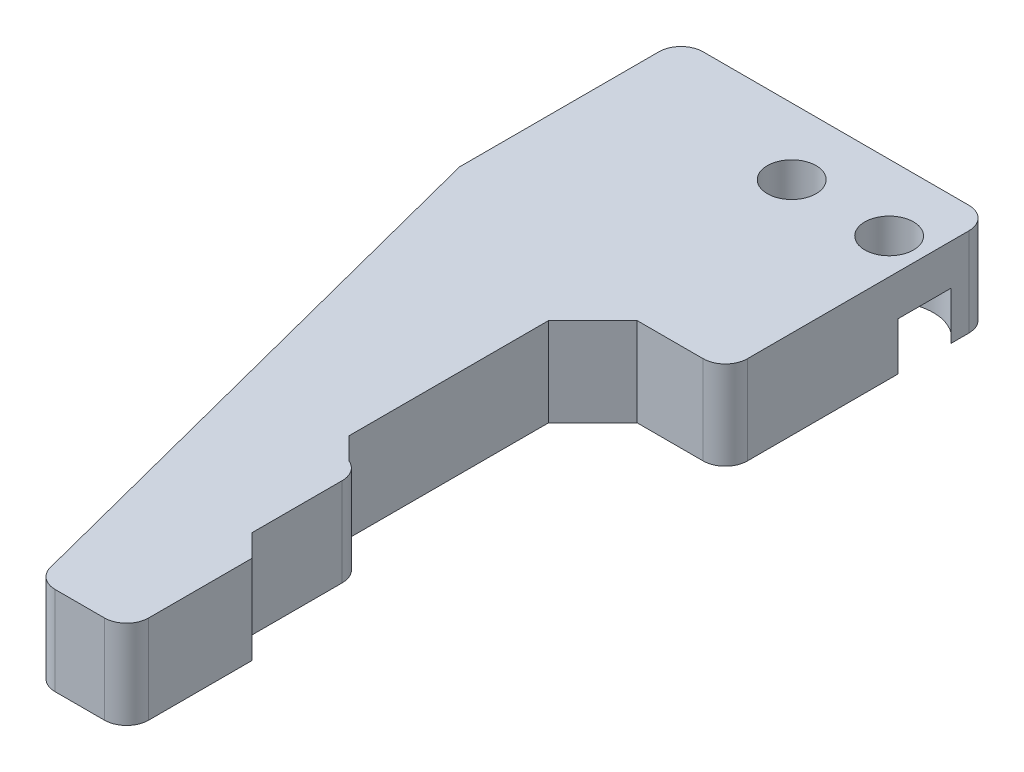
ISO-10303-21;
HEADER;
FILE_DESCRIPTION(('STEP AP214'),'2;1');
FILE_NAME('part.step','',(''),(''),'','','');
FILE_SCHEMA(('AUTOMOTIVE_DESIGN { 1 0 10303 214 1 1 1 1 }'));
ENDSEC;
DATA;
#1=APPLICATION_CONTEXT('core data for automotive mechanical design processes');
#2=APPLICATION_PROTOCOL_DEFINITION('international standard','automotive_design',2000,#1);
#3=PRODUCT_CONTEXT('',#1,'mechanical');
#4=PRODUCT('Part','Part','',(#3));
#5=PRODUCT_RELATED_PRODUCT_CATEGORY('part','',(#4));
#6=PRODUCT_DEFINITION_FORMATION('','',#4);
#7=PRODUCT_DEFINITION_CONTEXT('part definition',#1,'design');
#8=PRODUCT_DEFINITION('design','',#6,#7);
#9=PRODUCT_DEFINITION_SHAPE('','',#8);
#10=(LENGTH_UNIT() NAMED_UNIT(*) SI_UNIT(.MILLI.,.METRE.));
#11=(NAMED_UNIT(*) PLANE_ANGLE_UNIT() SI_UNIT($,.RADIAN.));
#12=(NAMED_UNIT(*) SI_UNIT($,.STERADIAN.) SOLID_ANGLE_UNIT());
#13=UNCERTAINTY_MEASURE_WITH_UNIT(LENGTH_MEASURE(1.E-05),#10,'distance_accuracy_value','');
#14=(GEOMETRIC_REPRESENTATION_CONTEXT(3) GLOBAL_UNCERTAINTY_ASSIGNED_CONTEXT((#13)) GLOBAL_UNIT_ASSIGNED_CONTEXT((#10,
#11,#12)) REPRESENTATION_CONTEXT('',''));
#15=CARTESIAN_POINT('',(0.,0.,0.));
#16=DIRECTION('',(0.,0.,1.));
#17=DIRECTION('',(1.,0.,0.));
#18=AXIS2_PLACEMENT_3D('',#15,#16,#17);
#19=CARTESIAN_POINT('',(0.,10.,-59.1354626519124));
#20=DIRECTION('',(-1.,0.,0.));
#21=DIRECTION('',(0.,0.,1.));
#22=AXIS2_PLACEMENT_3D('',#19,#20,#21);
#23=PLANE('',#22);
#24=DIRECTION('',(0.,0.,-1.));
#25=VECTOR('',#24,1.);
#26=CARTESIAN_POINT('',(0.,5.4,-59.1354626519124));
#27=LINE('',#26,#25);
#28=CARTESIAN_POINT('',(0.,5.4,-78.6354626519124));
#29=VERTEX_POINT('',#28);
#30=CARTESIAN_POINT('',(0.,5.4,-84.6354626519124));
#31=VERTEX_POINT('',#30);
#32=EDGE_CURVE('E11',#29,#31,#27,.T.);
#33=ORIENTED_EDGE('',*,*,#32,.T.);
#34=DIRECTION('',(0.,-1.,0.));
#35=VECTOR('',#34,1.);
#36=CARTESIAN_POINT('',(0.,0.,-84.6354626519124));
#37=LINE('',#36,#35);
#38=CARTESIAN_POINT('',(0.,0.,-84.6354626519124));
#39=VERTEX_POINT('',#38);
#40=EDGE_CURVE('E173',#31,#39,#37,.T.);
#41=ORIENTED_EDGE('',*,*,#40,.T.);
#42=DIRECTION('',(0.,0.,-1.));
#43=VECTOR('',#42,1.);
#44=CARTESIAN_POINT('',(0.,0.,-59.1354626519124));
#45=LINE('',#44,#43);
#46=CARTESIAN_POINT('',(0.,0.,-86.6354626519124));
#47=VERTEX_POINT('',#46);
#48=EDGE_CURVE('E206',#39,#47,#45,.T.);
#49=ORIENTED_EDGE('',*,*,#48,.T.);
#50=DIRECTION('',(0.,-1.,0.));
#51=VECTOR('',#50,1.);
#52=CARTESIAN_POINT('',(0.,10.,-86.6354626519124));
#53=LINE('',#52,#51);
#54=CARTESIAN_POINT('',(0.,10.,-86.6354626519124));
#55=VERTEX_POINT('',#54);
#56=EDGE_CURVE('E307',#47,#55,#53,.F.);
#57=ORIENTED_EDGE('',*,*,#56,.T.);
#58=DIRECTION('',(0.,0.,-1.));
#59=VECTOR('',#58,1.);
#60=CARTESIAN_POINT('',(0.,10.,-59.1354626519124));
#61=LINE('',#60,#59);
#62=CARTESIAN_POINT('',(0.,10.,-61.6354626519124));
#63=VERTEX_POINT('',#62);
#64=EDGE_CURVE('E207',#63,#55,#61,.T.);
#65=ORIENTED_EDGE('',*,*,#64,.F.);
#66=DIRECTION('',(0.,-1.,0.));
#67=VECTOR('',#66,1.);
#68=CARTESIAN_POINT('',(0.,10.,-61.6354626519124));
#69=LINE('',#68,#67);
#70=CARTESIAN_POINT('',(0.,0.,-61.6354626519124));
#71=VERTEX_POINT('',#70);
#72=EDGE_CURVE('E305',#63,#71,#69,.T.);
#73=ORIENTED_EDGE('',*,*,#72,.T.);
#74=CARTESIAN_POINT('',(0.,0.,-78.6354626519124));
#75=VERTEX_POINT('',#74);
#76=EDGE_CURVE('E188',#71,#75,#45,.T.);
#77=ORIENTED_EDGE('',*,*,#76,.T.);
#78=DIRECTION('',(0.,-1.,0.));
#79=VECTOR('',#78,1.);
#80=CARTESIAN_POINT('',(0.,0.,-78.6354626519124));
#81=LINE('',#80,#79);
#82=EDGE_CURVE('E50',#75,#29,#81,.F.);
#83=ORIENTED_EDGE('',*,*,#82,.T.);
#84=EDGE_LOOP('',(#33,#41,#49,#57,#65,#73,#77,#83));
#85=FACE_BOUND('',#84,.T.);
#86=ADVANCED_FACE('F35',(#85),#23,.F.);
#87=CARTESIAN_POINT('',(0.,10.,-89.1354626519124));
#88=DIRECTION('',(0.,0.,1.));
#89=DIRECTION('',(1.,0.,0.));
#90=AXIS2_PLACEMENT_3D('',#87,#88,#89);
#91=PLANE('',#90);
#92=DIRECTION('',(-1.,0.,0.));
#93=VECTOR('',#92,1.);
#94=CARTESIAN_POINT('',(0.,10.,-89.1354626519124));
#95=LINE('',#94,#93);
#96=CARTESIAN_POINT('',(-2.5,10.,-89.1354626519124));
#97=VERTEX_POINT('',#96);
#98=CARTESIAN_POINT('',(-32.5,10.,-89.1354626519124));
#99=VERTEX_POINT('',#98);
#100=EDGE_CURVE('E210',#97,#99,#95,.T.);
#101=ORIENTED_EDGE('',*,*,#100,.F.);
#102=DIRECTION('',(0.,-1.,0.));
#103=VECTOR('',#102,1.);
#104=CARTESIAN_POINT('',(-2.5,10.,-89.1354626519124));
#105=LINE('',#104,#103);
#106=CARTESIAN_POINT('',(-2.5,0.,-89.1354626519124));
#107=VERTEX_POINT('',#106);
#108=EDGE_CURVE('E289',#97,#107,#105,.T.);
#109=ORIENTED_EDGE('',*,*,#108,.T.);
#110=DIRECTION('',(-1.,0.,0.));
#111=VECTOR('',#110,1.);
#112=CARTESIAN_POINT('',(0.,0.,-89.1354626519124));
#113=LINE('',#112,#111);
#114=CARTESIAN_POINT('',(-32.5,0.,-89.1354626519124));
#115=VERTEX_POINT('',#114);
#116=EDGE_CURVE('E233',#107,#115,#113,.T.);
#117=ORIENTED_EDGE('',*,*,#116,.T.);
#118=DIRECTION('',(0.,-1.,0.));
#119=VECTOR('',#118,1.);
#120=CARTESIAN_POINT('',(-32.5,10.,-89.1354626519124));
#121=LINE('',#120,#119);
#122=EDGE_CURVE('E287',#115,#99,#121,.F.);
#123=ORIENTED_EDGE('',*,*,#122,.T.);
#124=EDGE_LOOP('',(#101,#109,#117,#123));
#125=FACE_BOUND('',#124,.T.);
#126=ADVANCED_FACE('F351',(#125),#91,.F.);
#127=CARTESIAN_POINT('',(-35.,10.,-64.1354626519124));
#128=DIRECTION('',(1.,0.,0.));
#129=DIRECTION('',(0.,0.,-1.));
#130=AXIS2_PLACEMENT_3D('',#127,#128,#129);
#131=PLANE('',#130);
#132=DIRECTION('',(0.,0.,1.));
#133=VECTOR('',#132,1.);
#134=CARTESIAN_POINT('',(-35.,10.,-64.1354626519124));
#135=LINE('',#134,#133);
#136=CARTESIAN_POINT('',(-35.,10.,-86.6354626519124));
#137=VERTEX_POINT('',#136);
#138=CARTESIAN_POINT('',(-35.,10.,-64.1354626519124));
#139=VERTEX_POINT('',#138);
#140=EDGE_CURVE('E214',#137,#139,#135,.T.);
#141=ORIENTED_EDGE('',*,*,#140,.F.);
#142=DIRECTION('',(0.,-1.,0.));
#143=VECTOR('',#142,1.);
#144=CARTESIAN_POINT('',(-35.,10.,-86.6354626519124));
#145=LINE('',#144,#143);
#146=CARTESIAN_POINT('',(-35.,0.,-86.6354626519124));
#147=VERTEX_POINT('',#146);
#148=EDGE_CURVE('E331',#137,#147,#145,.T.);
#149=ORIENTED_EDGE('',*,*,#148,.T.);
#150=DIRECTION('',(0.,0.,1.));
#151=VECTOR('',#150,1.);
#152=CARTESIAN_POINT('',(-35.,0.,-64.1354626519124));
#153=LINE('',#152,#151);
#154=CARTESIAN_POINT('',(-35.,0.,-64.1354626519124));
#155=VERTEX_POINT('',#154);
#156=EDGE_CURVE('E236',#147,#155,#153,.T.);
#157=ORIENTED_EDGE('',*,*,#156,.T.);
#158=DIRECTION('',(0.,-1.,0.));
#159=VECTOR('',#158,1.);
#160=CARTESIAN_POINT('',(-35.,10.,-64.1354626519124));
#161=LINE('',#160,#159);
#162=EDGE_CURVE('E254',#139,#155,#161,.T.);
#163=ORIENTED_EDGE('',*,*,#162,.F.);
#164=EDGE_LOOP('',(#141,#149,#157,#163));
#165=FACE_BOUND('',#164,.T.);
#166=ADVANCED_FACE('F361',(#165),#131,.F.);
#167=CARTESIAN_POINT('',(-18.45,10.,0.));
#168=DIRECTION('',(0.968281294725216,0.,-0.249862630829942));
#169=DIRECTION('',(-0.249862630829942,0.,-0.968281294725216));
#170=AXIS2_PLACEMENT_3D('',#167,#168,#169);
#171=PLANE('',#170);
#172=DIRECTION('',(0.249862630829942,0.,0.968281294725216));
#173=VECTOR('',#172,1.);
#174=CARTESIAN_POINT('',(-18.45,0.,0.));
#175=LINE('',#174,#173);
#176=CARTESIAN_POINT('',(-18.9339278047756,0.,-1.87534342292514));
#177=VERTEX_POINT('',#176);
#178=EDGE_CURVE('E238',#155,#177,#175,.T.);
#179=ORIENTED_EDGE('',*,*,#178,.T.);
#180=DIRECTION('',(0.,-1.,0.));
#181=VECTOR('',#180,1.);
#182=CARTESIAN_POINT('',(-18.9339278047756,10.,-1.87534342292514));
#183=LINE('',#182,#181);
#184=CARTESIAN_POINT('',(-18.9339278047756,10.,-1.87534342292514));
#185=VERTEX_POINT('',#184);
#186=EDGE_CURVE('E329',#177,#185,#183,.F.);
#187=ORIENTED_EDGE('',*,*,#186,.T.);
#188=DIRECTION('',(0.249862630829942,0.,0.968281294725216));
#189=VECTOR('',#188,1.);
#190=CARTESIAN_POINT('',(-18.45,10.,0.));
#191=LINE('',#190,#189);
#192=EDGE_CURVE('E216',#139,#185,#191,.T.);
#193=ORIENTED_EDGE('',*,*,#192,.F.);
#194=ORIENTED_EDGE('',*,*,#162,.T.);
#195=EDGE_LOOP('',(#179,#187,#193,#194));
#196=FACE_BOUND('',#195,.T.);
#197=ADVANCED_FACE('F564',(#196),#171,.F.);
#198=CARTESIAN_POINT('',(-8.44999999999999,10.,0.));
#199=DIRECTION('',(0.,0.,-1.));
#200=DIRECTION('',(-1.,0.,0.));
#201=AXIS2_PLACEMENT_3D('',#198,#199,#200);
#202=PLANE('',#201);
#203=DIRECTION('',(1.,0.,0.));
#204=VECTOR('',#203,1.);
#205=CARTESIAN_POINT('',(-8.44999999999999,0.,0.));
#206=LINE('',#205,#204);
#207=CARTESIAN_POINT('',(-16.5132245679626,0.,0.));
#208=VERTEX_POINT('',#207);
#209=CARTESIAN_POINT('',(-10.95,0.,0.));
#210=VERTEX_POINT('',#209);
#211=EDGE_CURVE('E241',#208,#210,#206,.T.);
#212=ORIENTED_EDGE('',*,*,#211,.T.);
#213=DIRECTION('',(0.,-1.,0.));
#214=VECTOR('',#213,1.);
#215=CARTESIAN_POINT('',(-10.95,10.,0.));
#216=LINE('',#215,#214);
#217=CARTESIAN_POINT('',(-10.95,10.,0.));
#218=VERTEX_POINT('',#217);
#219=EDGE_CURVE('E327',#210,#218,#216,.F.);
#220=ORIENTED_EDGE('',*,*,#219,.T.);
#221=DIRECTION('',(1.,0.,0.));
#222=VECTOR('',#221,1.);
#223=CARTESIAN_POINT('',(-8.44999999999999,10.,0.));
#224=LINE('',#223,#222);
#225=CARTESIAN_POINT('',(-16.5132245679626,10.,0.));
#226=VERTEX_POINT('',#225);
#227=EDGE_CURVE('E219',#226,#218,#224,.T.);
#228=ORIENTED_EDGE('',*,*,#227,.F.);
#229=DIRECTION('',(0.,-1.,0.));
#230=VECTOR('',#229,1.);
#231=CARTESIAN_POINT('',(-16.5132245679626,10.,0.));
#232=LINE('',#231,#230);
#233=EDGE_CURVE('E324',#226,#208,#232,.T.);
#234=ORIENTED_EDGE('',*,*,#233,.T.);
#235=EDGE_LOOP('',(#212,#220,#228,#234));
#236=FACE_BOUND('',#235,.T.);
#237=ADVANCED_FACE('F373',(#236),#202,.F.);
#238=CARTESIAN_POINT('',(-8.44999999999999,10.,-14.1354626519124));
#239=DIRECTION('',(-1.,0.,0.));
#240=DIRECTION('',(0.,0.,1.));
#241=AXIS2_PLACEMENT_3D('',#238,#239,#240);
#242=PLANE('',#241);
#243=DIRECTION('',(0.,0.,-1.));
#244=VECTOR('',#243,1.);
#245=CARTESIAN_POINT('',(-8.44999999999999,10.,-14.1354626519124));
#246=LINE('',#245,#244);
#247=CARTESIAN_POINT('',(-8.44999999999999,10.,-2.5));
#248=VERTEX_POINT('',#247);
#249=CARTESIAN_POINT('',(-8.44999999999999,10.,-14.1354626519124));
#250=VERTEX_POINT('',#249);
#251=EDGE_CURVE('E222',#248,#250,#246,.T.);
#252=ORIENTED_EDGE('',*,*,#251,.F.);
#253=DIRECTION('',(0.,-1.,0.));
#254=VECTOR('',#253,1.);
#255=CARTESIAN_POINT('',(-8.44999999999999,10.,-2.5));
#256=LINE('',#255,#254);
#257=CARTESIAN_POINT('',(-8.44999999999999,0.,-2.5));
#258=VERTEX_POINT('',#257);
#259=EDGE_CURVE('E321',#248,#258,#256,.T.);
#260=ORIENTED_EDGE('',*,*,#259,.T.);
#261=DIRECTION('',(0.,0.,-1.));
#262=VECTOR('',#261,1.);
#263=CARTESIAN_POINT('',(-8.44999999999999,0.,-14.1354626519124));
#264=LINE('',#263,#262);
#265=CARTESIAN_POINT('',(-8.44999999999999,0.,-14.1354626519124));
#266=VERTEX_POINT('',#265);
#267=EDGE_CURVE('E244',#258,#266,#264,.T.);
#268=ORIENTED_EDGE('',*,*,#267,.T.);
#269=DIRECTION('',(0.,-1.,0.));
#270=VECTOR('',#269,1.);
#271=CARTESIAN_POINT('',(-8.44999999999999,10.,-14.1354626519124));
#272=LINE('',#271,#270);
#273=EDGE_CURVE('E231',#250,#266,#272,.T.);
#274=ORIENTED_EDGE('',*,*,#273,.F.);
#275=EDGE_LOOP('',(#252,#260,#268,#274));
#276=FACE_BOUND('',#275,.T.);
#277=ADVANCED_FACE('F382',(#276),#242,.F.);
#278=CARTESIAN_POINT('',(-10.95,10.,-29.1354626519124));
#279=DIRECTION('',(-1.,0.,0.));
#280=DIRECTION('',(0.,0.,1.));
#281=AXIS2_PLACEMENT_3D('',#278,#279,#280);
#282=PLANE('',#281);
#283=DIRECTION('',(0.,0.,-1.));
#284=VECTOR('',#283,1.);
#285=CARTESIAN_POINT('',(-10.95,0.,-29.1354626519124));
#286=LINE('',#285,#284);
#287=CARTESIAN_POINT('',(-10.95,0.,-16.6354626519124));
#288=VERTEX_POINT('',#287);
#289=CARTESIAN_POINT('',(-10.95,0.,-26.8441748044345));
#290=VERTEX_POINT('',#289);
#291=EDGE_CURVE('E246',#288,#290,#286,.T.);
#292=ORIENTED_EDGE('',*,*,#291,.T.);
#293=DIRECTION('',(0.,1.,0.));
#294=VECTOR('',#293,1.);
#295=CARTESIAN_POINT('',(-10.95,10.,-26.8441748044345));
#296=LINE('',#295,#294);
#297=CARTESIAN_POINT('',(-10.95,10.,-26.8441748044345));
#298=VERTEX_POINT('',#297);
#299=EDGE_CURVE('E335',#290,#298,#296,.T.);
#300=ORIENTED_EDGE('',*,*,#299,.T.);
#301=DIRECTION('',(0.,0.,-1.));
#302=VECTOR('',#301,1.);
#303=CARTESIAN_POINT('',(-10.95,10.,-29.1354626519124));
#304=LINE('',#303,#302);
#305=CARTESIAN_POINT('',(-10.95,10.,-16.6354626519124));
#306=VERTEX_POINT('',#305);
#307=EDGE_CURVE('E224',#306,#298,#304,.T.);
#308=ORIENTED_EDGE('',*,*,#307,.F.);
#309=DIRECTION('',(0.,-1.,0.));
#310=VECTOR('',#309,1.);
#311=CARTESIAN_POINT('',(-10.95,0.,-16.6354626519124));
#312=LINE('',#311,#310);
#313=EDGE_CURVE('E268',#306,#288,#312,.T.);
#314=ORIENTED_EDGE('',*,*,#313,.T.);
#315=EDGE_LOOP('',(#292,#300,#308,#314));
#316=FACE_BOUND('',#315,.T.);
#317=ADVANCED_FACE('F390',(#316),#282,.F.);
#318=CARTESIAN_POINT('',(-14.95,10.,-59.1354626519124));
#319=DIRECTION('',(-1.,0.,0.));
#320=DIRECTION('',(0.,0.,1.));
#321=AXIS2_PLACEMENT_3D('',#318,#319,#320);
#322=PLANE('',#321);
#323=DIRECTION('',(0.,0.,-1.));
#324=VECTOR('',#323,1.);
#325=CARTESIAN_POINT('',(-14.95,10.,-59.1354626519124));
#326=LINE('',#325,#324);
#327=CARTESIAN_POINT('',(-14.95,10.,-31.6354626519124));
#328=VERTEX_POINT('',#327);
#329=CARTESIAN_POINT('',(-14.95,10.,-54.1354626519124));
#330=VERTEX_POINT('',#329);
#331=EDGE_CURVE('E227',#328,#330,#326,.T.);
#332=ORIENTED_EDGE('',*,*,#331,.F.);
#333=DIRECTION('',(0.,-1.,0.));
#334=VECTOR('',#333,1.);
#335=CARTESIAN_POINT('',(-14.95,0.,-31.6354626519124));
#336=LINE('',#335,#334);
#337=CARTESIAN_POINT('',(-14.95,0.,-31.6354626519124));
#338=VERTEX_POINT('',#337);
#339=EDGE_CURVE('E271',#328,#338,#336,.T.);
#340=ORIENTED_EDGE('',*,*,#339,.T.);
#341=DIRECTION('',(0.,0.,-1.));
#342=VECTOR('',#341,1.);
#343=CARTESIAN_POINT('',(-14.95,0.,-59.1354626519124));
#344=LINE('',#343,#342);
#345=CARTESIAN_POINT('',(-14.95,0.,-54.1354626519124));
#346=VERTEX_POINT('',#345);
#347=EDGE_CURVE('E249',#338,#346,#344,.T.);
#348=ORIENTED_EDGE('',*,*,#347,.T.);
#349=DIRECTION('',(0.,1.,0.));
#350=VECTOR('',#349,1.);
#351=CARTESIAN_POINT('',(-14.95,10.,-54.1354626519124));
#352=LINE('',#351,#350);
#353=EDGE_CURVE('E260',#346,#330,#352,.T.);
#354=ORIENTED_EDGE('',*,*,#353,.T.);
#355=EDGE_LOOP('',(#332,#340,#348,#354));
#356=FACE_BOUND('',#355,.T.);
#357=ADVANCED_FACE('F403',(#356),#322,.F.);
#358=CARTESIAN_POINT('',(0.,10.,-59.1354626519124));
#359=DIRECTION('',(0.,0.,-1.));
#360=DIRECTION('',(-1.,0.,0.));
#361=AXIS2_PLACEMENT_3D('',#358,#359,#360);
#362=PLANE('',#361);
#363=DIRECTION('',(1.,0.,0.));
#364=VECTOR('',#363,1.);
#365=CARTESIAN_POINT('',(0.,0.,-59.1354626519124));
#366=LINE('',#365,#364);
#367=CARTESIAN_POINT('',(-9.94999999999997,0.,-59.1354626519124));
#368=VERTEX_POINT('',#367);
#369=CARTESIAN_POINT('',(-2.5,0.,-59.1354626519124));
#370=VERTEX_POINT('',#369);
#371=EDGE_CURVE('E211',#368,#370,#366,.T.);
#372=ORIENTED_EDGE('',*,*,#371,.T.);
#373=DIRECTION('',(0.,-1.,0.));
#374=VECTOR('',#373,1.);
#375=CARTESIAN_POINT('',(-2.5,10.,-59.1354626519124));
#376=LINE('',#375,#374);
#377=CARTESIAN_POINT('',(-2.5,10.,-59.1354626519124));
#378=VERTEX_POINT('',#377);
#379=EDGE_CURVE('E58',#370,#378,#376,.F.);
#380=ORIENTED_EDGE('',*,*,#379,.T.);
#381=DIRECTION('',(1.,0.,0.));
#382=VECTOR('',#381,1.);
#383=CARTESIAN_POINT('',(0.,10.,-59.1354626519124));
#384=LINE('',#383,#382);
#385=CARTESIAN_POINT('',(-9.94999999999997,10.,-59.1354626519124));
#386=VERTEX_POINT('',#385);
#387=EDGE_CURVE('E229',#386,#378,#384,.T.);
#388=ORIENTED_EDGE('',*,*,#387,.F.);
#389=DIRECTION('',(0.,-1.,0.));
#390=VECTOR('',#389,1.);
#391=CARTESIAN_POINT('',(-9.94999999999997,0.,-59.1354626519124));
#392=LINE('',#391,#390);
#393=EDGE_CURVE('E257',#386,#368,#392,.T.);
#394=ORIENTED_EDGE('',*,*,#393,.T.);
#395=EDGE_LOOP('',(#372,#380,#388,#394));
#396=FACE_BOUND('',#395,.T.);
#397=ADVANCED_FACE('F410',(#396),#362,.F.);
#398=CARTESIAN_POINT('',(0.,10.,0.));
#399=DIRECTION('',(0.,1.,0.));
#400=DIRECTION('',(0.,0.,1.));
#401=AXIS2_PLACEMENT_3D('',#398,#399,#400);
#402=PLANE('',#401);
#403=CARTESIAN_POINT('',(-3.99999999999999,10.,-81.6354626519124));
#404=DIRECTION('',(0.,-1.,0.));
#405=DIRECTION('',(0.,0.,-1.));
#406=AXIS2_PLACEMENT_3D('',#403,#404,#405);
#407=CIRCLE('',#406,2.75);
#408=CARTESIAN_POINT('',(-3.99999999999999,10.,-84.3854626519124));
#409=VERTEX_POINT('',#408);
#410=EDGE_CURVE('E189',#409,#409,#407,.T.);
#411=ORIENTED_EDGE('',*,*,#410,.T.);
#412=EDGE_LOOP('',(#411));
#413=FACE_BOUND('',#412,.T.);
#414=CARTESIAN_POINT('',(-15.,10.,-81.6354626519124));
#415=DIRECTION('',(0.,-1.,0.));
#416=DIRECTION('',(0.,0.,-1.));
#417=AXIS2_PLACEMENT_3D('',#414,#415,#416);
#418=CIRCLE('',#417,2.75);
#419=CARTESIAN_POINT('',(-15.,10.,-84.3854626519124));
#420=VERTEX_POINT('',#419);
#421=EDGE_CURVE('E203',#420,#420,#418,.T.);
#422=ORIENTED_EDGE('',*,*,#421,.T.);
#423=EDGE_LOOP('',(#422));
#424=FACE_BOUND('',#423,.T.);
#425=ORIENTED_EDGE('',*,*,#64,.T.);
#426=CARTESIAN_POINT('',(-2.5,10.,-86.6354626519124));
#427=DIRECTION('',(0.,1.,0.));
#428=DIRECTION('',(0.,0.,1.));
#429=AXIS2_PLACEMENT_3D('',#426,#427,#428);
#430=CIRCLE('',#429,2.5);
#431=EDGE_CURVE('E319',#55,#97,#430,.T.);
#432=ORIENTED_EDGE('',*,*,#431,.T.);
#433=ORIENTED_EDGE('',*,*,#100,.T.);
#434=CARTESIAN_POINT('',(-32.5,10.,-86.6354626519124));
#435=DIRECTION('',(0.,1.,0.));
#436=DIRECTION('',(0.,0.,1.));
#437=AXIS2_PLACEMENT_3D('',#434,#435,#436);
#438=CIRCLE('',#437,2.5);
#439=EDGE_CURVE('E313',#99,#137,#438,.T.);
#440=ORIENTED_EDGE('',*,*,#439,.T.);
#441=ORIENTED_EDGE('',*,*,#140,.T.);
#442=ORIENTED_EDGE('',*,*,#192,.T.);
#443=CARTESIAN_POINT('',(-16.5132245679626,10.,-2.5));
#444=DIRECTION('',(0.,1.,0.));
#445=DIRECTION('',(0.,0.,1.));
#446=AXIS2_PLACEMENT_3D('',#443,#444,#445);
#447=CIRCLE('',#446,2.5);
#448=EDGE_CURVE('E315',#185,#226,#447,.T.);
#449=ORIENTED_EDGE('',*,*,#448,.T.);
#450=ORIENTED_EDGE('',*,*,#227,.T.);
#451=CARTESIAN_POINT('',(-10.95,10.,-2.5));
#452=DIRECTION('',(0.,1.,0.));
#453=DIRECTION('',(0.,0.,1.));
#454=AXIS2_PLACEMENT_3D('',#451,#452,#453);
#455=CIRCLE('',#454,2.5);
#456=EDGE_CURVE('E317',#218,#248,#455,.T.);
#457=ORIENTED_EDGE('',*,*,#456,.T.);
#458=ORIENTED_EDGE('',*,*,#251,.T.);
#459=DIRECTION('',(0.707106781186544,0.,0.707106781186551));
#460=VECTOR('',#459,1.);
#461=CARTESIAN_POINT('',(-10.95,10.,-16.6354626519124));
#462=LINE('',#461,#460);
#463=EDGE_CURVE('E280',#250,#306,#462,.F.);
#464=ORIENTED_EDGE('',*,*,#463,.T.);
#465=ORIENTED_EDGE('',*,*,#307,.T.);
#466=CARTESIAN_POINT('',(-13.45,10.,-26.8441748044345));
#467=DIRECTION('',(0.,1.,0.));
#468=DIRECTION('',(0.,0.,1.));
#469=AXIS2_PLACEMENT_3D('',#466,#467,#468);
#470=CIRCLE('',#469,2.5);
#471=CARTESIAN_POINT('',(-12.45,10.,-29.1354626519124));
#472=VERTEX_POINT('',#471);
#473=EDGE_CURVE('E309',#298,#472,#470,.T.);
#474=ORIENTED_EDGE('',*,*,#473,.T.);
#475=DIRECTION('',(0.707106781186542,0.,0.707106781186553));
#476=VECTOR('',#475,1.);
#477=CARTESIAN_POINT('',(-14.95,10.,-31.6354626519124));
#478=LINE('',#477,#476);
#479=EDGE_CURVE('E285',#472,#328,#478,.F.);
#480=ORIENTED_EDGE('',*,*,#479,.T.);
#481=ORIENTED_EDGE('',*,*,#331,.T.);
#482=DIRECTION('',(-0.707106781186551,0.,0.707106781186544));
#483=VECTOR('',#482,1.);
#484=CARTESIAN_POINT('',(-9.94999999999997,10.,-59.1354626519124));
#485=LINE('',#484,#483);
#486=EDGE_CURVE('E266',#330,#386,#485,.F.);
#487=ORIENTED_EDGE('',*,*,#486,.T.);
#488=ORIENTED_EDGE('',*,*,#387,.T.);
#489=CARTESIAN_POINT('',(-2.5,10.,-61.6354626519124));
#490=DIRECTION('',(0.,1.,0.));
#491=DIRECTION('',(0.,0.,1.));
#492=AXIS2_PLACEMENT_3D('',#489,#490,#491);
#493=CIRCLE('',#492,2.5);
#494=EDGE_CURVE('E311',#378,#63,#493,.T.);
#495=ORIENTED_EDGE('',*,*,#494,.T.);
#496=EDGE_LOOP('',(#425,#432,#433,#440,#441,#442,#449,#450,#457,#458,#464,#465,#474,#480,#481,
#487,#488,#495));
#497=FACE_BOUND('',#496,.T.);
#498=ADVANCED_FACE('F345',(#413,#424,#497),#402,.T.);
#499=CARTESIAN_POINT('',(0.,0.,0.));
#500=DIRECTION('',(0.,1.,0.));
#501=DIRECTION('',(0.,0.,1.));
#502=AXIS2_PLACEMENT_3D('',#499,#500,#501);
#503=PLANE('',#502);
#504=CARTESIAN_POINT('',(-15.,0.,-81.6354626519124));
#505=DIRECTION('',(0.,-1.,0.));
#506=DIRECTION('',(0.,0.,-1.));
#507=AXIS2_PLACEMENT_3D('',#504,#505,#506);
#508=CIRCLE('',#507,4.99999999999999);
#509=CARTESIAN_POINT('',(-15.,0.,-86.6354626519124));
#510=VERTEX_POINT('',#509);
#511=EDGE_CURVE('E179',#510,#510,#508,.T.);
#512=ORIENTED_EDGE('',*,*,#511,.F.);
#513=EDGE_LOOP('',(#512));
#514=FACE_BOUND('',#513,.T.);
#515=ORIENTED_EDGE('',*,*,#48,.F.);
#516=CARTESIAN_POINT('',(-3.99999999999999,0.,-81.6354626519124));
#517=DIRECTION('',(0.,1.,0.));
#518=DIRECTION('',(0.,0.,1.));
#519=AXIS2_PLACEMENT_3D('',#516,#517,#518);
#520=CIRCLE('',#519,4.99999999999999);
#521=EDGE_CURVE('E43',#39,#75,#520,.T.);
#522=ORIENTED_EDGE('',*,*,#521,.T.);
#523=ORIENTED_EDGE('',*,*,#76,.F.);
#524=CARTESIAN_POINT('',(-2.5,0.,-61.6354626519124));
#525=DIRECTION('',(0.,1.,0.));
#526=DIRECTION('',(0.,0.,1.));
#527=AXIS2_PLACEMENT_3D('',#524,#525,#526);
#528=CIRCLE('',#527,2.5);
#529=EDGE_CURVE('E294',#71,#370,#528,.F.);
#530=ORIENTED_EDGE('',*,*,#529,.T.);
#531=ORIENTED_EDGE('',*,*,#371,.F.);
#532=DIRECTION('',(0.707106781186551,0.,-0.707106781186544));
#533=VECTOR('',#532,1.);
#534=CARTESIAN_POINT('',(-34.5427313259561,0.,-34.5427313259565));
#535=LINE('',#534,#533);
#536=EDGE_CURVE('E263',#368,#346,#535,.F.);
#537=ORIENTED_EDGE('',*,*,#536,.T.);
#538=ORIENTED_EDGE('',*,*,#347,.F.);
#539=DIRECTION('',(-0.707106781186542,0.,-0.707106781186553));
#540=VECTOR('',#539,1.);
#541=CARTESIAN_POINT('',(8.3427313259561,0.,-8.34273132595596));
#542=LINE('',#541,#540);
#543=CARTESIAN_POINT('',(-12.45,0.,-29.1354626519124));
#544=VERTEX_POINT('',#543);
#545=EDGE_CURVE('E282',#338,#544,#542,.F.);
#546=ORIENTED_EDGE('',*,*,#545,.T.);
#547=CARTESIAN_POINT('',(-13.45,0.,-26.8441748044345));
#548=DIRECTION('',(0.,1.,0.));
#549=DIRECTION('',(0.,0.,1.));
#550=AXIS2_PLACEMENT_3D('',#547,#548,#549);
#551=CIRCLE('',#550,2.5);
#552=EDGE_CURVE('E292',#544,#290,#551,.F.);
#553=ORIENTED_EDGE('',*,*,#552,.T.);
#554=ORIENTED_EDGE('',*,*,#291,.F.);
#555=DIRECTION('',(-0.707106781186544,0.,-0.707106781186551));
#556=VECTOR('',#555,1.);
#557=CARTESIAN_POINT('',(2.84273132595616,0.,-2.84273132595613));
#558=LINE('',#557,#556);
#559=EDGE_CURVE('E277',#288,#266,#558,.F.);
#560=ORIENTED_EDGE('',*,*,#559,.T.);
#561=ORIENTED_EDGE('',*,*,#267,.F.);
#562=CARTESIAN_POINT('',(-10.95,0.,-2.5));
#563=DIRECTION('',(0.,1.,0.));
#564=DIRECTION('',(0.,0.,1.));
#565=AXIS2_PLACEMENT_3D('',#562,#563,#564);
#566=CIRCLE('',#565,2.5);
#567=EDGE_CURVE('E300',#258,#210,#566,.F.);
#568=ORIENTED_EDGE('',*,*,#567,.T.);
#569=ORIENTED_EDGE('',*,*,#211,.F.);
#570=CARTESIAN_POINT('',(-16.5132245679626,0.,-2.5));
#571=DIRECTION('',(0.,1.,0.));
#572=DIRECTION('',(0.,0.,1.));
#573=AXIS2_PLACEMENT_3D('',#570,#571,#572);
#574=CIRCLE('',#573,2.5);
#575=EDGE_CURVE('E298',#208,#177,#574,.F.);
#576=ORIENTED_EDGE('',*,*,#575,.T.);
#577=ORIENTED_EDGE('',*,*,#178,.F.);
#578=ORIENTED_EDGE('',*,*,#156,.F.);
#579=CARTESIAN_POINT('',(-32.5,0.,-86.6354626519124));
#580=DIRECTION('',(0.,1.,0.));
#581=DIRECTION('',(0.,0.,1.));
#582=AXIS2_PLACEMENT_3D('',#579,#580,#581);
#583=CIRCLE('',#582,2.5);
#584=EDGE_CURVE('E296',#147,#115,#583,.F.);
#585=ORIENTED_EDGE('',*,*,#584,.T.);
#586=ORIENTED_EDGE('',*,*,#116,.F.);
#587=CARTESIAN_POINT('',(-2.5,0.,-86.6354626519124));
#588=DIRECTION('',(0.,1.,0.));
#589=DIRECTION('',(0.,0.,1.));
#590=AXIS2_PLACEMENT_3D('',#587,#588,#589);
#591=CIRCLE('',#590,2.5);
#592=EDGE_CURVE('E302',#107,#47,#591,.F.);
#593=ORIENTED_EDGE('',*,*,#592,.T.);
#594=EDGE_LOOP('',(#515,#522,#523,#530,#531,#537,#538,#546,#553,#554,#560,#561,#568,#569,#576,
#577,#578,#585,#586,#593));
#595=FACE_BOUND('',#594,.T.);
#596=ADVANCED_FACE('F337',(#514,#595),#503,.F.);
#597=CARTESIAN_POINT('',(-9.94999999999997,10.,-59.1354626519124));
#598=DIRECTION('',(0.707106781186544,0.,0.707106781186551));
#599=DIRECTION('',(0.,1.,0.));
#600=AXIS2_PLACEMENT_3D('',#597,#598,#599);
#601=PLANE('',#600);
#602=ORIENTED_EDGE('',*,*,#486,.F.);
#603=ORIENTED_EDGE('',*,*,#353,.F.);
#604=ORIENTED_EDGE('',*,*,#536,.F.);
#605=ORIENTED_EDGE('',*,*,#393,.F.);
#606=EDGE_LOOP('',(#602,#603,#604,#605));
#607=FACE_BOUND('',#606,.T.);
#608=ADVANCED_FACE('F409',(#607),#601,.T.);
#609=CARTESIAN_POINT('',(-10.95,10.,-16.6354626519124));
#610=DIRECTION('',(0.707106781186551,0.,-0.707106781186543));
#611=DIRECTION('',(0.,1.,0.));
#612=AXIS2_PLACEMENT_3D('',#609,#610,#611);
#613=PLANE('',#612);
#614=ORIENTED_EDGE('',*,*,#463,.F.);
#615=ORIENTED_EDGE('',*,*,#273,.T.);
#616=ORIENTED_EDGE('',*,*,#559,.F.);
#617=ORIENTED_EDGE('',*,*,#313,.F.);
#618=EDGE_LOOP('',(#614,#615,#616,#617));
#619=FACE_BOUND('',#618,.T.);
#620=ADVANCED_FACE('F393',(#619),#613,.T.);
#621=CARTESIAN_POINT('',(-14.95,10.,-31.6354626519124));
#622=DIRECTION('',(0.707106781186553,0.,-0.707106781186542));
#623=DIRECTION('',(0.,1.,0.));
#624=AXIS2_PLACEMENT_3D('',#621,#622,#623);
#625=PLANE('',#624);
#626=ORIENTED_EDGE('',*,*,#479,.F.);
#627=DIRECTION('',(0.,1.,0.));
#628=VECTOR('',#627,1.);
#629=CARTESIAN_POINT('',(-12.45,10.,-29.1354626519124));
#630=LINE('',#629,#628);
#631=EDGE_CURVE('E274',#544,#472,#630,.T.);
#632=ORIENTED_EDGE('',*,*,#631,.F.);
#633=ORIENTED_EDGE('',*,*,#545,.F.);
#634=ORIENTED_EDGE('',*,*,#339,.F.);
#635=EDGE_LOOP('',(#626,#632,#633,#634));
#636=FACE_BOUND('',#635,.T.);
#637=ADVANCED_FACE('F400',(#636),#625,.T.);
#638=CARTESIAN_POINT('',(-2.5,10.,-86.6354626519124));
#639=DIRECTION('',(0.,-1.,0.));
#640=DIRECTION('',(0.,0.,-1.));
#641=AXIS2_PLACEMENT_3D('',#638,#639,#640);
#642=CYLINDRICAL_SURFACE('',#641,2.5);
#643=ORIENTED_EDGE('',*,*,#431,.F.);
#644=ORIENTED_EDGE('',*,*,#56,.F.);
#645=ORIENTED_EDGE('',*,*,#592,.F.);
#646=ORIENTED_EDGE('',*,*,#108,.F.);
#647=EDGE_LOOP('',(#643,#644,#645,#646));
#648=FACE_BOUND('',#647,.T.);
#649=ADVANCED_FACE('F349',(#648),#642,.T.);
#650=CARTESIAN_POINT('',(-10.95,10.,-2.5));
#651=DIRECTION('',(0.,-1.,0.));
#652=DIRECTION('',(0.,0.,-1.));
#653=AXIS2_PLACEMENT_3D('',#650,#651,#652);
#654=CYLINDRICAL_SURFACE('',#653,2.5);
#655=ORIENTED_EDGE('',*,*,#456,.F.);
#656=ORIENTED_EDGE('',*,*,#219,.F.);
#657=ORIENTED_EDGE('',*,*,#567,.F.);
#658=ORIENTED_EDGE('',*,*,#259,.F.);
#659=EDGE_LOOP('',(#655,#656,#657,#658));
#660=FACE_BOUND('',#659,.T.);
#661=ADVANCED_FACE('F379',(#660),#654,.T.);
#662=CARTESIAN_POINT('',(-16.5132245679626,10.,-2.5));
#663=DIRECTION('',(0.,-1.,0.));
#664=DIRECTION('',(0.,0.,-1.));
#665=AXIS2_PLACEMENT_3D('',#662,#663,#664);
#666=CYLINDRICAL_SURFACE('',#665,2.5);
#667=ORIENTED_EDGE('',*,*,#448,.F.);
#668=ORIENTED_EDGE('',*,*,#186,.F.);
#669=ORIENTED_EDGE('',*,*,#575,.F.);
#670=ORIENTED_EDGE('',*,*,#233,.F.);
#671=EDGE_LOOP('',(#667,#668,#669,#670));
#672=FACE_BOUND('',#671,.T.);
#673=ADVANCED_FACE('F370',(#672),#666,.T.);
#674=CARTESIAN_POINT('',(-32.5,10.,-86.6354626519124));
#675=DIRECTION('',(0.,-1.,0.));
#676=DIRECTION('',(0.,0.,-1.));
#677=AXIS2_PLACEMENT_3D('',#674,#675,#676);
#678=CYLINDRICAL_SURFACE('',#677,2.5);
#679=ORIENTED_EDGE('',*,*,#439,.F.);
#680=ORIENTED_EDGE('',*,*,#122,.F.);
#681=ORIENTED_EDGE('',*,*,#584,.F.);
#682=ORIENTED_EDGE('',*,*,#148,.F.);
#683=EDGE_LOOP('',(#679,#680,#681,#682));
#684=FACE_BOUND('',#683,.T.);
#685=ADVANCED_FACE('F358',(#684),#678,.T.);
#686=CARTESIAN_POINT('',(-2.5,10.,-61.6354626519124));
#687=DIRECTION('',(0.,-1.,0.));
#688=DIRECTION('',(0.,0.,-1.));
#689=AXIS2_PLACEMENT_3D('',#686,#687,#688);
#690=CYLINDRICAL_SURFACE('',#689,2.5);
#691=ORIENTED_EDGE('',*,*,#494,.F.);
#692=ORIENTED_EDGE('',*,*,#379,.F.);
#693=ORIENTED_EDGE('',*,*,#529,.F.);
#694=ORIENTED_EDGE('',*,*,#72,.F.);
#695=EDGE_LOOP('',(#691,#692,#693,#694));
#696=FACE_BOUND('',#695,.T.);
#697=ADVANCED_FACE('F412',(#696),#690,.T.);
#698=CARTESIAN_POINT('',(-13.45,10.,-26.8441748044345));
#699=DIRECTION('',(0.,1.,0.));
#700=DIRECTION('',(0.,0.,1.));
#701=AXIS2_PLACEMENT_3D('',#698,#699,#700);
#702=CYLINDRICAL_SURFACE('',#701,2.5);
#703=ORIENTED_EDGE('',*,*,#473,.F.);
#704=ORIENTED_EDGE('',*,*,#299,.F.);
#705=ORIENTED_EDGE('',*,*,#552,.F.);
#706=ORIENTED_EDGE('',*,*,#631,.T.);
#707=EDGE_LOOP('',(#703,#704,#705,#706));
#708=FACE_BOUND('',#707,.T.);
#709=ADVANCED_FACE('F37',(#708),#702,.T.);
#710=CARTESIAN_POINT('',(-15.,0.,-81.6354626519124));
#711=DIRECTION('',(0.,-1.,0.));
#712=DIRECTION('',(0.,0.,-1.));
#713=AXIS2_PLACEMENT_3D('',#710,#711,#712);
#714=CYLINDRICAL_SURFACE('',#713,2.75);
#715=ORIENTED_EDGE('',*,*,#421,.F.);
#716=EDGE_LOOP('',(#715));
#717=FACE_BOUND('',#716,.T.);
#718=CARTESIAN_POINT('',(-15.,5.4,-81.6354626519124));
#719=DIRECTION('',(0.,-1.,0.));
#720=DIRECTION('',(0.,0.,-1.));
#721=AXIS2_PLACEMENT_3D('',#718,#719,#720);
#722=CIRCLE('',#721,2.75);
#723=CARTESIAN_POINT('',(-15.,5.4,-84.3854626519124));
#724=VERTEX_POINT('',#723);
#725=EDGE_CURVE('E200',#724,#724,#722,.T.);
#726=ORIENTED_EDGE('',*,*,#725,.T.);
#727=EDGE_LOOP('',(#726));
#728=FACE_BOUND('',#727,.T.);
#729=ADVANCED_FACE('F418',(#717,#728),#714,.F.);
#730=CARTESIAN_POINT('',(-12.25,5.4,-81.6354626519124));
#731=DIRECTION('',(0.,1.,0.));
#732=DIRECTION('',(0.,0.,1.));
#733=AXIS2_PLACEMENT_3D('',#730,#731,#732);
#734=PLANE('',#733);
#735=ORIENTED_EDGE('',*,*,#725,.F.);
#736=EDGE_LOOP('',(#735));
#737=FACE_BOUND('',#736,.T.);
#738=CARTESIAN_POINT('',(-15.,5.4,-81.6354626519124));
#739=DIRECTION('',(0.,-1.,0.));
#740=DIRECTION('',(0.,0.,-1.));
#741=AXIS2_PLACEMENT_3D('',#738,#739,#740);
#742=CIRCLE('',#741,4.99999999999999);
#743=CARTESIAN_POINT('',(-15.,5.4,-86.6354626519124));
#744=VERTEX_POINT('',#743);
#745=EDGE_CURVE('E197',#744,#744,#742,.T.);
#746=ORIENTED_EDGE('',*,*,#745,.T.);
#747=EDGE_LOOP('',(#746));
#748=FACE_BOUND('',#747,.T.);
#749=ADVANCED_FACE('F501',(#737,#748),#734,.F.);
#750=CARTESIAN_POINT('',(-15.,0.,-81.6354626519124));
#751=DIRECTION('',(0.,-1.,0.));
#752=DIRECTION('',(0.,0.,-1.));
#753=AXIS2_PLACEMENT_3D('',#750,#751,#752);
#754=CYLINDRICAL_SURFACE('',#753,4.99999999999999);
#755=ORIENTED_EDGE('',*,*,#745,.F.);
#756=EDGE_LOOP('',(#755));
#757=FACE_BOUND('',#756,.T.);
#758=ORIENTED_EDGE('',*,*,#511,.T.);
#759=EDGE_LOOP('',(#758));
#760=FACE_BOUND('',#759,.T.);
#761=ADVANCED_FACE('F511',(#757,#760),#754,.F.);
#762=CARTESIAN_POINT('',(-1.24999999999999,5.4,-81.6354626519124));
#763=DIRECTION('',(0.,1.,0.));
#764=DIRECTION('',(0.,0.,1.));
#765=AXIS2_PLACEMENT_3D('',#762,#763,#764);
#766=PLANE('',#765);
#767=CARTESIAN_POINT('',(-3.99999999999999,5.4,-81.6354626519124));
#768=DIRECTION('',(0.,-1.,0.));
#769=DIRECTION('',(0.,0.,-1.));
#770=AXIS2_PLACEMENT_3D('',#767,#768,#769);
#771=CIRCLE('',#770,2.75);
#772=CARTESIAN_POINT('',(-3.99999999999999,5.4,-84.3854626519124));
#773=VERTEX_POINT('',#772);
#774=EDGE_CURVE('E183',#773,#773,#771,.T.);
#775=ORIENTED_EDGE('',*,*,#774,.F.);
#776=EDGE_LOOP('',(#775));
#777=FACE_BOUND('',#776,.T.);
#778=CARTESIAN_POINT('',(-3.99999999999999,5.4,-81.6354626519124));
#779=DIRECTION('',(0.,-1.,0.));
#780=DIRECTION('',(0.,0.,-1.));
#781=AXIS2_PLACEMENT_3D('',#778,#779,#780);
#782=CIRCLE('',#781,4.99999999999999);
#783=EDGE_CURVE('E176',#29,#31,#782,.T.);
#784=ORIENTED_EDGE('',*,*,#783,.T.);
#785=ORIENTED_EDGE('',*,*,#32,.F.);
#786=EDGE_LOOP('',(#784,#785));
#787=FACE_BOUND('',#786,.T.);
#788=ADVANCED_FACE('F182',(#777,#787),#766,.F.);
#789=CARTESIAN_POINT('',(-3.99999999999999,0.,-81.6354626519124));
#790=DIRECTION('',(0.,-1.,0.));
#791=DIRECTION('',(0.,0.,-1.));
#792=AXIS2_PLACEMENT_3D('',#789,#790,#791);
#793=CYLINDRICAL_SURFACE('',#792,4.99999999999999);
#794=ORIENTED_EDGE('',*,*,#783,.F.);
#795=ORIENTED_EDGE('',*,*,#82,.F.);
#796=ORIENTED_EDGE('',*,*,#521,.F.);
#797=ORIENTED_EDGE('',*,*,#40,.F.);
#798=EDGE_LOOP('',(#794,#795,#796,#797));
#799=FACE_BOUND('',#798,.T.);
#800=ADVANCED_FACE('F175',(#799),#793,.F.);
#801=CARTESIAN_POINT('',(-3.99999999999999,0.,-81.6354626519124));
#802=DIRECTION('',(0.,-1.,0.));
#803=DIRECTION('',(0.,0.,-1.));
#804=AXIS2_PLACEMENT_3D('',#801,#802,#803);
#805=CYLINDRICAL_SURFACE('',#804,2.75);
#806=ORIENTED_EDGE('',*,*,#410,.F.);
#807=EDGE_LOOP('',(#806));
#808=FACE_BOUND('',#807,.T.);
#809=ORIENTED_EDGE('',*,*,#774,.T.);
#810=EDGE_LOOP('',(#809));
#811=FACE_BOUND('',#810,.T.);
#812=ADVANCED_FACE('F539',(#808,#811),#805,.F.);
#813=CLOSED_SHELL('',(#86,#126,#166,#197,#237,#277,#317,#357,#397,#498,#596,#608,#620,#637,#649,
#661,#673,#685,#697,#709,#729,#749,#761,#788,#800,#812));
#814=MANIFOLD_SOLID_BREP('B2',#813);
#815=ADVANCED_BREP_SHAPE_REPRESENTATION('',(#18,#814),#14);
#816=SHAPE_DEFINITION_REPRESENTATION(#9,#815);
ENDSEC;
END-ISO-10303-21;
